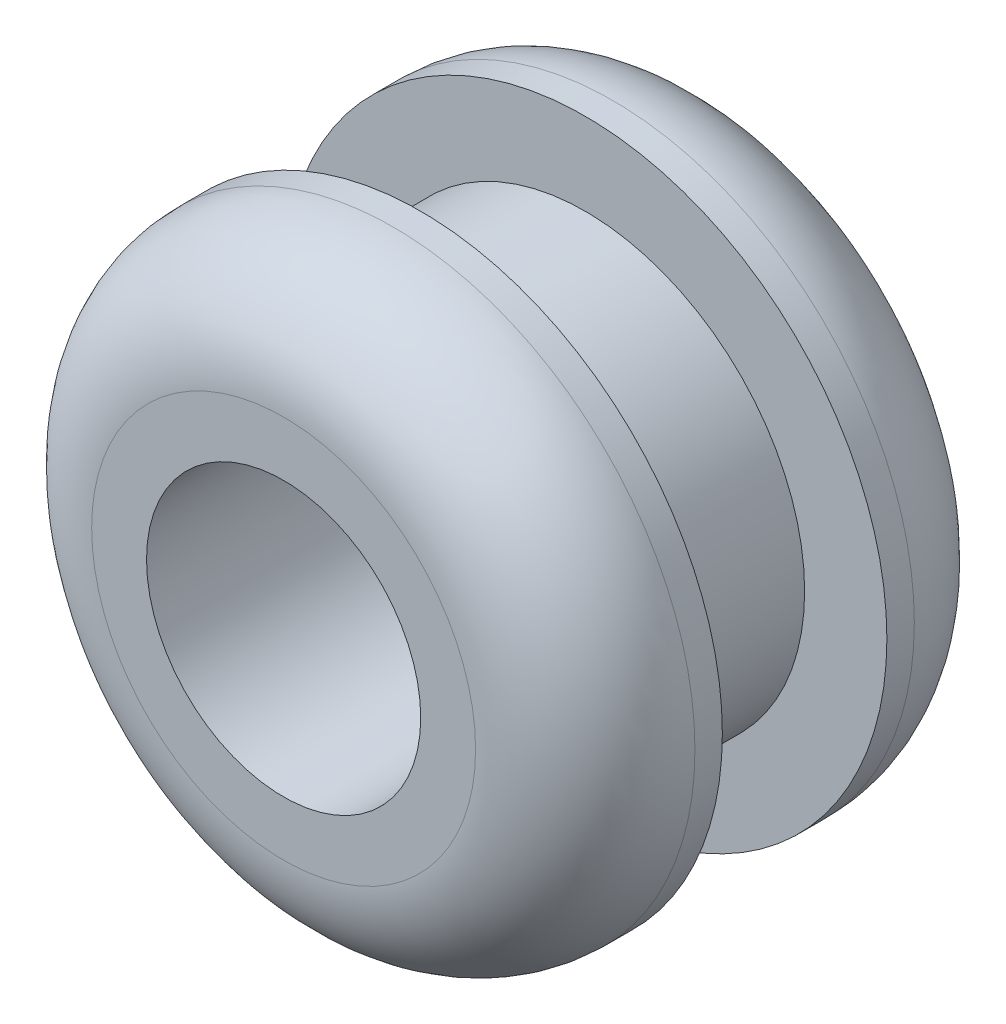
ISO-10303-21;
HEADER;
FILE_DESCRIPTION(('STEP AP214'),'2;1');
FILE_NAME('part.step','',(''),(''),'','','');
FILE_SCHEMA(('AUTOMOTIVE_DESIGN { 1 0 10303 214 1 1 1 1 }'));
ENDSEC;
DATA;
#1=APPLICATION_CONTEXT('core data for automotive mechanical design processes');
#2=APPLICATION_PROTOCOL_DEFINITION('international standard','automotive_design',2000,#1);
#3=PRODUCT_CONTEXT('',#1,'mechanical');
#4=PRODUCT('Part','Part','',(#3));
#5=PRODUCT_RELATED_PRODUCT_CATEGORY('part','',(#4));
#6=PRODUCT_DEFINITION_FORMATION('','',#4);
#7=PRODUCT_DEFINITION_CONTEXT('part definition',#1,'design');
#8=PRODUCT_DEFINITION('design','',#6,#7);
#9=PRODUCT_DEFINITION_SHAPE('','',#8);
#10=(LENGTH_UNIT() NAMED_UNIT(*) SI_UNIT(.MILLI.,.METRE.));
#11=(NAMED_UNIT(*) PLANE_ANGLE_UNIT() SI_UNIT($,.RADIAN.));
#12=(NAMED_UNIT(*) SI_UNIT($,.STERADIAN.) SOLID_ANGLE_UNIT());
#13=UNCERTAINTY_MEASURE_WITH_UNIT(LENGTH_MEASURE(1.E-05),#10,'distance_accuracy_value','');
#14=(GEOMETRIC_REPRESENTATION_CONTEXT(3) GLOBAL_UNCERTAINTY_ASSIGNED_CONTEXT((#13)) GLOBAL_UNIT_ASSIGNED_CONTEXT((#10,
#11,#12)) REPRESENTATION_CONTEXT('',''));
#15=CARTESIAN_POINT('',(0.,0.,0.));
#16=DIRECTION('',(0.,0.,1.));
#17=DIRECTION('',(1.,0.,0.));
#18=AXIS2_PLACEMENT_3D('',#15,#16,#17);
#19=CARTESIAN_POINT('',(-154.750000000003,399.297149814937,-402.857743681072));
#20=DIRECTION('',(0.,0.,1.));
#21=DIRECTION('',(1.,0.,0.));
#22=AXIS2_PLACEMENT_3D('',#19,#20,#21);
#23=CYLINDRICAL_SURFACE('',#22,4.);
#24=CARTESIAN_POINT('',(-154.750000000003,399.297149814937,-401.357743681072));
#25=DIRECTION('',(0.,0.,1.));
#26=DIRECTION('',(1.,0.,0.));
#27=AXIS2_PLACEMENT_3D('',#24,#25,#26);
#28=CIRCLE('',#27,4.);
#29=CARTESIAN_POINT('',(-150.750000000003,399.297149814937,-401.357743681072));
#30=VERTEX_POINT('',#29);
#31=EDGE_CURVE('E119',#30,#30,#28,.T.);
#32=ORIENTED_EDGE('',*,*,#31,.F.);
#33=EDGE_LOOP('',(#32));
#34=FACE_BOUND('',#33,.T.);
#35=CARTESIAN_POINT('',(-154.750000000003,399.297149814937,-404.357743681072));
#36=DIRECTION('',(0.,0.,1.));
#37=DIRECTION('',(1.,0.,0.));
#38=AXIS2_PLACEMENT_3D('',#35,#36,#37);
#39=CIRCLE('',#38,4.);
#40=CARTESIAN_POINT('',(-150.750000000003,399.297149814937,-404.357743681072));
#41=VERTEX_POINT('',#40);
#42=EDGE_CURVE('E122',#41,#41,#39,.F.);
#43=ORIENTED_EDGE('',*,*,#42,.F.);
#44=EDGE_LOOP('',(#43));
#45=FACE_BOUND('',#44,.T.);
#46=ADVANCED_FACE('F17',(#34,#45),#23,.T.);
#47=CARTESIAN_POINT('',(-154.750000000003,399.297149814937,-404.357743681072));
#48=DIRECTION('',(0.,0.,1.));
#49=DIRECTION('',(1.,0.,0.));
#50=AXIS2_PLACEMENT_3D('',#47,#48,#49);
#51=PLANE('',#50);
#52=ORIENTED_EDGE('',*,*,#42,.T.);
#53=EDGE_LOOP('',(#52));
#54=FACE_BOUND('',#53,.T.);
#55=CARTESIAN_POINT('',(-154.750000000003,399.297149814937,-404.357743681072));
#56=DIRECTION('',(0.,0.,1.));
#57=DIRECTION('',(1.,0.,0.));
#58=AXIS2_PLACEMENT_3D('',#55,#56,#57);
#59=CIRCLE('',#58,5.5);
#60=CARTESIAN_POINT('',(-149.250000000003,399.297149814937,-404.357743681072));
#61=VERTEX_POINT('',#60);
#62=EDGE_CURVE('E116',#61,#61,#59,.F.);
#63=ORIENTED_EDGE('',*,*,#62,.F.);
#64=EDGE_LOOP('',(#63));
#65=FACE_BOUND('',#64,.T.);
#66=ADVANCED_FACE('F265',(#54,#65),#51,.T.);
#67=CARTESIAN_POINT('',(-154.750000000003,399.297149814937,-401.357743681072));
#68=DIRECTION('',(0.,0.,-1.));
#69=DIRECTION('',(-1.,0.,0.));
#70=AXIS2_PLACEMENT_3D('',#67,#68,#69);
#71=PLANE('',#70);
#72=ORIENTED_EDGE('',*,*,#31,.T.);
#73=EDGE_LOOP('',(#72));
#74=FACE_BOUND('',#73,.T.);
#75=CARTESIAN_POINT('',(-154.750000000003,399.297149814937,-401.357743681072));
#76=DIRECTION('',(0.,0.,1.));
#77=DIRECTION('',(1.,0.,0.));
#78=AXIS2_PLACEMENT_3D('',#75,#76,#77);
#79=CIRCLE('',#78,5.5);
#80=CARTESIAN_POINT('',(-149.250000000003,399.297149814937,-401.357743681072));
#81=VERTEX_POINT('',#80);
#82=EDGE_CURVE('E109',#81,#81,#79,.T.);
#83=ORIENTED_EDGE('',*,*,#82,.F.);
#84=EDGE_LOOP('',(#83));
#85=FACE_BOUND('',#84,.T.);
#86=ADVANCED_FACE('F256',(#74,#85),#71,.T.);
#87=CARTESIAN_POINT('',(-154.750000000003,399.297149814937,-405.607743681072));
#88=DIRECTION('',(0.,0.,1.));
#89=DIRECTION('',(1.,0.,0.));
#90=AXIS2_PLACEMENT_3D('',#87,#88,#89);
#91=CYLINDRICAL_SURFACE('',#90,5.5);
#92=CARTESIAN_POINT('',(-154.750000000003,399.297149814937,-404.857743681072));
#93=DIRECTION('',(0.,0.,-1.));
#94=DIRECTION('',(1.,0.,0.));
#95=AXIS2_PLACEMENT_3D('',#92,#93,#94);
#96=CIRCLE('',#95,5.50000000000001);
#97=CARTESIAN_POINT('',(-149.250000000003,399.297149814937,-404.857743681072));
#98=VERTEX_POINT('',#97);
#99=EDGE_CURVE('E107',#98,#98,#96,.T.);
#100=ORIENTED_EDGE('',*,*,#99,.F.);
#101=EDGE_LOOP('',(#100));
#102=FACE_BOUND('',#101,.T.);
#103=ORIENTED_EDGE('',*,*,#62,.T.);
#104=EDGE_LOOP('',(#103));
#105=FACE_BOUND('',#104,.T.);
#106=ADVANCED_FACE('F247',(#102,#105),#91,.T.);
#107=CARTESIAN_POINT('',(-154.750000000003,399.297149814937,-400.107743681072));
#108=DIRECTION('',(0.,0.,1.));
#109=DIRECTION('',(1.,0.,0.));
#110=AXIS2_PLACEMENT_3D('',#107,#108,#109);
#111=CYLINDRICAL_SURFACE('',#110,5.5);
#112=CARTESIAN_POINT('',(-154.750000000003,399.297149814937,-400.857743681072));
#113=DIRECTION('',(0.,0.,1.));
#114=DIRECTION('',(-1.,0.,0.));
#115=AXIS2_PLACEMENT_3D('',#112,#113,#114);
#116=CIRCLE('',#115,5.50000000000001);
#117=CARTESIAN_POINT('',(-160.250000000003,399.297149814937,-400.857743681072));
#118=VERTEX_POINT('',#117);
#119=EDGE_CURVE('E68',#118,#118,#116,.T.);
#120=ORIENTED_EDGE('',*,*,#119,.F.);
#121=EDGE_LOOP('',(#120));
#122=FACE_BOUND('',#121,.T.);
#123=ORIENTED_EDGE('',*,*,#82,.T.);
#124=EDGE_LOOP('',(#123));
#125=FACE_BOUND('',#124,.T.);
#126=ADVANCED_FACE('F84',(#122,#125),#111,.T.);
#127=CARTESIAN_POINT('',(-154.750000000003,399.297149814937,-404.857743681072));
#128=DIRECTION('',(0.,0.,-1.));
#129=DIRECTION('',(1.,0.,0.));
#130=AXIS2_PLACEMENT_3D('',#127,#128,#129);
#131=TOROIDAL_SURFACE('',#130,3.5,2.);
#132=CARTESIAN_POINT('',(-154.750000000003,399.297149814937,-406.857743681072));
#133=DIRECTION('',(0.,0.,1.));
#134=DIRECTION('',(-0.866025403784394,0.500000000000076,0.));
#135=AXIS2_PLACEMENT_3D('',#132,#133,#134);
#136=CIRCLE('',#135,3.49999999999952);
#137=CARTESIAN_POINT('',(-158.250000000003,399.297149814937,-406.857743681072));
#138=VERTEX_POINT('',#137);
#139=CARTESIAN_POINT('',(-157.781088913248,401.047149814937,-406.857743681072));
#140=VERTEX_POINT('',#139);
#141=EDGE_CURVE('E55',#138,#140,#136,.F.);
#142=ORIENTED_EDGE('',*,*,#141,.F.);
#143=CARTESIAN_POINT('',(-154.750000000003,399.297149814937,-406.857743681072));
#144=DIRECTION('',(0.,0.,1.));
#145=DIRECTION('',(-1.,0.,0.));
#146=AXIS2_PLACEMENT_3D('',#143,#144,#145);
#147=CIRCLE('',#146,3.5);
#148=CARTESIAN_POINT('',(-151.250000000003,399.297149814937,-406.857743681072));
#149=VERTEX_POINT('',#148);
#150=EDGE_CURVE('E57',#149,#138,#147,.F.);
#151=ORIENTED_EDGE('',*,*,#150,.F.);
#152=CARTESIAN_POINT('',(-154.750000000003,399.297149814937,-406.857743681072));
#153=DIRECTION('',(0.,0.,1.));
#154=DIRECTION('',(1.,0.,0.));
#155=AXIS2_PLACEMENT_3D('',#152,#153,#154);
#156=CIRCLE('',#155,3.5);
#157=EDGE_CURVE('E51',#140,#149,#156,.F.);
#158=ORIENTED_EDGE('',*,*,#157,.F.);
#159=EDGE_LOOP('',(#142,#151,#158));
#160=FACE_BOUND('',#159,.T.);
#161=ORIENTED_EDGE('',*,*,#99,.T.);
#162=EDGE_LOOP('',(#161));
#163=FACE_BOUND('',#162,.T.);
#164=ADVANCED_FACE('F65',(#160,#163),#131,.T.);
#165=CARTESIAN_POINT('',(-154.750000000003,399.297149814937,-400.857743681072));
#166=DIRECTION('',(0.,0.,1.));
#167=DIRECTION('',(-1.,0.,0.));
#168=AXIS2_PLACEMENT_3D('',#165,#166,#167);
#169=TOROIDAL_SURFACE('',#168,3.5,2.);
#170=CARTESIAN_POINT('',(-154.750000000003,399.297149814937,-398.857743681072));
#171=DIRECTION('',(0.,0.,-1.));
#172=DIRECTION('',(-0.866025403784394,0.500000000000076,0.));
#173=AXIS2_PLACEMENT_3D('',#170,#171,#172);
#174=CIRCLE('',#173,3.49999999999952);
#175=CARTESIAN_POINT('',(-151.250000000003,399.297149814937,-398.857743681072));
#176=VERTEX_POINT('',#175);
#177=CARTESIAN_POINT('',(-157.781088913248,401.047149814937,-398.857743681072));
#178=VERTEX_POINT('',#177);
#179=EDGE_CURVE('E62',#176,#178,#174,.F.);
#180=ORIENTED_EDGE('',*,*,#179,.F.);
#181=CARTESIAN_POINT('',(-154.750000000003,399.297149814937,-398.857743681072));
#182=DIRECTION('',(0.,0.,-1.));
#183=DIRECTION('',(1.,0.,0.));
#184=AXIS2_PLACEMENT_3D('',#181,#182,#183);
#185=CIRCLE('',#184,3.5);
#186=CARTESIAN_POINT('',(-158.250000000003,399.297149814937,-398.857743681072));
#187=VERTEX_POINT('',#186);
#188=EDGE_CURVE('E113',#187,#176,#185,.F.);
#189=ORIENTED_EDGE('',*,*,#188,.F.);
#190=CARTESIAN_POINT('',(-154.750000000003,399.297149814937,-398.857743681072));
#191=DIRECTION('',(0.,0.,-1.));
#192=DIRECTION('',(-1.,0.,0.));
#193=AXIS2_PLACEMENT_3D('',#190,#191,#192);
#194=CIRCLE('',#193,3.5);
#195=EDGE_CURVE('E37',#178,#187,#194,.F.);
#196=ORIENTED_EDGE('',*,*,#195,.F.);
#197=EDGE_LOOP('',(#180,#189,#196));
#198=FACE_BOUND('',#197,.T.);
#199=ORIENTED_EDGE('',*,*,#119,.T.);
#200=EDGE_LOOP('',(#199));
#201=FACE_BOUND('',#200,.T.);
#202=ADVANCED_FACE('F83',(#198,#201),#169,.T.);
#203=CARTESIAN_POINT('',(-154.750000000003,399.297149814937,-406.857743681072));
#204=DIRECTION('',(0.,0.,-1.));
#205=DIRECTION('',(-1.,0.,0.));
#206=AXIS2_PLACEMENT_3D('',#203,#204,#205);
#207=PLANE('',#206);
#208=CARTESIAN_POINT('',(-154.750000000003,399.297149814937,-406.857743681072));
#209=DIRECTION('',(0.,0.,1.));
#210=DIRECTION('',(1.,0.,0.));
#211=AXIS2_PLACEMENT_3D('',#208,#209,#210);
#212=CIRCLE('',#211,2.5);
#213=CARTESIAN_POINT('',(-152.250000000003,399.297149814937,-406.857743681072));
#214=VERTEX_POINT('',#213);
#215=EDGE_CURVE('E28',#214,#214,#212,.T.);
#216=ORIENTED_EDGE('',*,*,#215,.T.);
#217=EDGE_LOOP('',(#216));
#218=FACE_BOUND('',#217,.T.);
#219=ORIENTED_EDGE('',*,*,#157,.T.);
#220=ORIENTED_EDGE('',*,*,#150,.T.);
#221=ORIENTED_EDGE('',*,*,#141,.T.);
#222=EDGE_LOOP('',(#219,#220,#221));
#223=FACE_BOUND('',#222,.T.);
#224=ADVANCED_FACE('F59',(#218,#223),#207,.T.);
#225=CARTESIAN_POINT('',(-154.750000000003,399.297149814937,-398.857743681072));
#226=DIRECTION('',(0.,0.,1.));
#227=DIRECTION('',(1.,0.,0.));
#228=AXIS2_PLACEMENT_3D('',#225,#226,#227);
#229=PLANE('',#228);
#230=CARTESIAN_POINT('',(-154.750000000003,399.297149814937,-398.857743681072));
#231=DIRECTION('',(0.,0.,1.));
#232=DIRECTION('',(1.,0.,0.));
#233=AXIS2_PLACEMENT_3D('',#230,#231,#232);
#234=CIRCLE('',#233,2.5);
#235=CARTESIAN_POINT('',(-152.250000000003,399.297149814937,-398.857743681072));
#236=VERTEX_POINT('',#235);
#237=EDGE_CURVE('E11',#236,#236,#234,.F.);
#238=ORIENTED_EDGE('',*,*,#237,.T.);
#239=EDGE_LOOP('',(#238));
#240=FACE_BOUND('',#239,.T.);
#241=ORIENTED_EDGE('',*,*,#195,.T.);
#242=ORIENTED_EDGE('',*,*,#188,.T.);
#243=ORIENTED_EDGE('',*,*,#179,.T.);
#244=EDGE_LOOP('',(#241,#242,#243));
#245=FACE_BOUND('',#244,.T.);
#246=ADVANCED_FACE('F146',(#240,#245),#229,.T.);
#247=CARTESIAN_POINT('',(-154.750000000003,399.297149814937,-402.857743681072));
#248=DIRECTION('',(0.,0.,1.));
#249=DIRECTION('',(1.,0.,0.));
#250=AXIS2_PLACEMENT_3D('',#247,#248,#249);
#251=CYLINDRICAL_SURFACE('',#250,2.5);
#252=ORIENTED_EDGE('',*,*,#237,.F.);
#253=EDGE_LOOP('',(#252));
#254=FACE_BOUND('',#253,.T.);
#255=ORIENTED_EDGE('',*,*,#215,.F.);
#256=EDGE_LOOP('',(#255));
#257=FACE_BOUND('',#256,.T.);
#258=ADVANCED_FACE('F163',(#254,#257),#251,.F.);
#259=CLOSED_SHELL('',(#46,#66,#86,#106,#126,#164,#202,#224,#246,#258));
#260=MANIFOLD_SOLID_BREP('B1',#259);
#261=ADVANCED_BREP_SHAPE_REPRESENTATION('',(#18,#260),#14);
#262=SHAPE_DEFINITION_REPRESENTATION(#9,#261);
ENDSEC;
END-ISO-10303-21;
